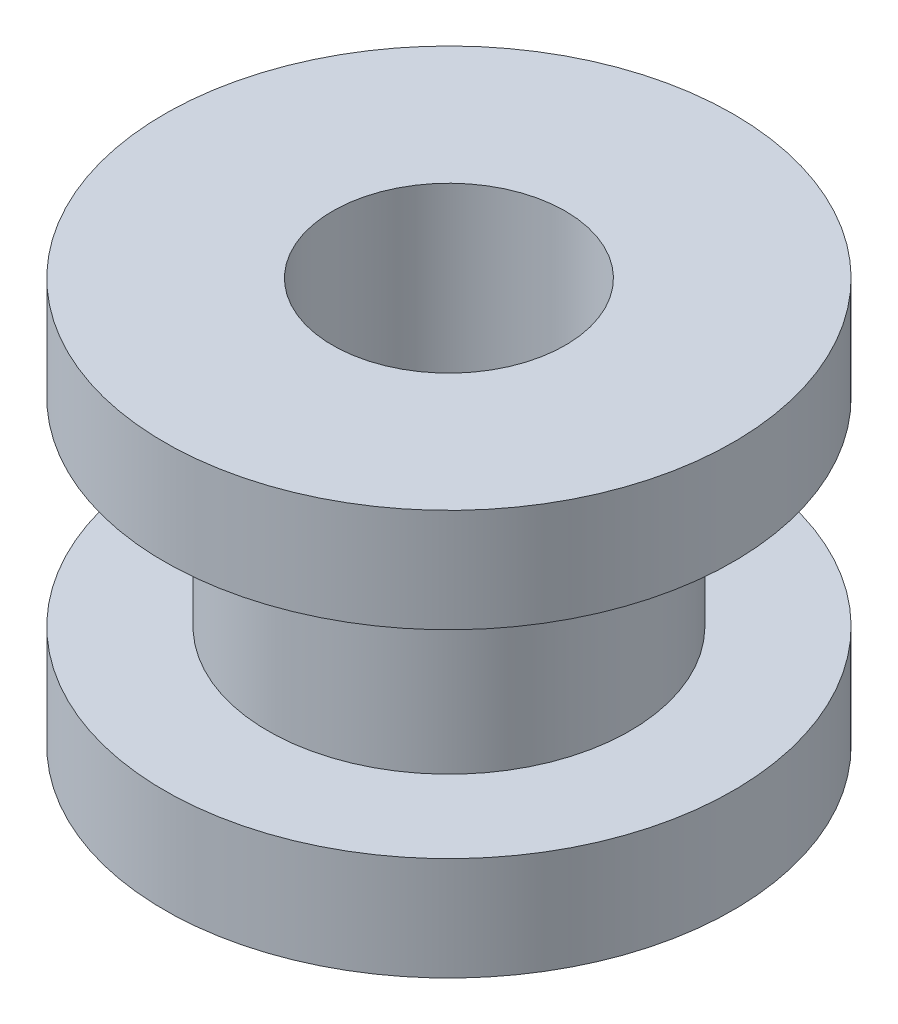
ISO-10303-21;
HEADER;
FILE_DESCRIPTION(('STEP AP214'),'2;1');
FILE_NAME('part.step','',(''),(''),'','','');
FILE_SCHEMA(('AUTOMOTIVE_DESIGN { 1 0 10303 214 1 1 1 1 }'));
ENDSEC;
DATA;
#1=APPLICATION_CONTEXT('core data for automotive mechanical design processes');
#2=APPLICATION_PROTOCOL_DEFINITION('international standard','automotive_design',2000,#1);
#3=PRODUCT_CONTEXT('',#1,'mechanical');
#4=PRODUCT('Part','Part','',(#3));
#5=PRODUCT_RELATED_PRODUCT_CATEGORY('part','',(#4));
#6=PRODUCT_DEFINITION_FORMATION('','',#4);
#7=PRODUCT_DEFINITION_CONTEXT('part definition',#1,'design');
#8=PRODUCT_DEFINITION('design','',#6,#7);
#9=PRODUCT_DEFINITION_SHAPE('','',#8);
#10=(LENGTH_UNIT() NAMED_UNIT(*) SI_UNIT(.MILLI.,.METRE.));
#11=(NAMED_UNIT(*) PLANE_ANGLE_UNIT() SI_UNIT($,.RADIAN.));
#12=(NAMED_UNIT(*) SI_UNIT($,.STERADIAN.) SOLID_ANGLE_UNIT());
#13=UNCERTAINTY_MEASURE_WITH_UNIT(LENGTH_MEASURE(1.E-05),#10,'distance_accuracy_value','');
#14=(GEOMETRIC_REPRESENTATION_CONTEXT(3) GLOBAL_UNCERTAINTY_ASSIGNED_CONTEXT((#13)) GLOBAL_UNIT_ASSIGNED_CONTEXT((#10,
#11,#12)) REPRESENTATION_CONTEXT('',''));
#15=CARTESIAN_POINT('',(0.,0.,0.));
#16=DIRECTION('',(0.,0.,1.));
#17=DIRECTION('',(1.,0.,0.));
#18=AXIS2_PLACEMENT_3D('',#15,#16,#17);
#19=CARTESIAN_POINT('',(0.,0.,0.));
#20=DIRECTION('',(0.,-1.,0.));
#21=DIRECTION('',(0.,0.,-1.));
#22=AXIS2_PLACEMENT_3D('',#19,#20,#21);
#23=CYLINDRICAL_SURFACE('',#22,3.3);
#24=CARTESIAN_POINT('',(0.,1.15,0.));
#25=DIRECTION('',(0.,-1.,0.));
#26=DIRECTION('',(0.,0.,-1.));
#27=AXIS2_PLACEMENT_3D('',#24,#25,#26);
#28=CIRCLE('',#27,3.3);
#29=CARTESIAN_POINT('',(0.,1.15,-3.3));
#30=VERTEX_POINT('',#29);
#31=EDGE_CURVE('E10',#30,#30,#28,.T.);
#32=ORIENTED_EDGE('',*,*,#31,.F.);
#33=EDGE_LOOP('',(#32));
#34=FACE_BOUND('',#33,.T.);
#35=CARTESIAN_POINT('',(0.,2.35,0.));
#36=DIRECTION('',(0.,-1.,0.));
#37=DIRECTION('',(0.,0.,-1.));
#38=AXIS2_PLACEMENT_3D('',#35,#36,#37);
#39=CIRCLE('',#38,3.3);
#40=CARTESIAN_POINT('',(0.,2.35,-3.3));
#41=VERTEX_POINT('',#40);
#42=EDGE_CURVE('E64',#41,#41,#39,.T.);
#43=ORIENTED_EDGE('',*,*,#42,.T.);
#44=EDGE_LOOP('',(#43));
#45=FACE_BOUND('',#44,.T.);
#46=ADVANCED_FACE('F36',(#34,#45),#23,.T.);
#47=CARTESIAN_POINT('',(-3.3,1.15,0.));
#48=DIRECTION('',(0.,1.,0.));
#49=DIRECTION('',(0.,0.,1.));
#50=AXIS2_PLACEMENT_3D('',#47,#48,#49);
#51=PLANE('',#50);
#52=CARTESIAN_POINT('',(0.,1.15,0.));
#53=DIRECTION('',(0.,-1.,0.));
#54=DIRECTION('',(0.,0.,-1.));
#55=AXIS2_PLACEMENT_3D('',#52,#53,#54);
#56=CIRCLE('',#55,2.1);
#57=CARTESIAN_POINT('',(0.,1.15,-2.1));
#58=VERTEX_POINT('',#57);
#59=EDGE_CURVE('E42',#58,#58,#56,.T.);
#60=ORIENTED_EDGE('',*,*,#59,.F.);
#61=EDGE_LOOP('',(#60));
#62=FACE_BOUND('',#61,.T.);
#63=ORIENTED_EDGE('',*,*,#31,.T.);
#64=EDGE_LOOP('',(#63));
#65=FACE_BOUND('',#64,.T.);
#66=ADVANCED_FACE('F101',(#62,#65),#51,.F.);
#67=CARTESIAN_POINT('',(0.,0.,0.));
#68=DIRECTION('',(0.,-1.,0.));
#69=DIRECTION('',(0.,0.,-1.));
#70=AXIS2_PLACEMENT_3D('',#67,#68,#69);
#71=CYLINDRICAL_SURFACE('',#70,2.1);
#72=CARTESIAN_POINT('',(0.,-1.15,0.));
#73=DIRECTION('',(0.,-1.,0.));
#74=DIRECTION('',(0.,0.,-1.));
#75=AXIS2_PLACEMENT_3D('',#72,#73,#74);
#76=CIRCLE('',#75,2.1);
#77=CARTESIAN_POINT('',(0.,-1.15,-2.1));
#78=VERTEX_POINT('',#77);
#79=EDGE_CURVE('E46',#78,#78,#76,.T.);
#80=ORIENTED_EDGE('',*,*,#79,.F.);
#81=EDGE_LOOP('',(#80));
#82=FACE_BOUND('',#81,.T.);
#83=ORIENTED_EDGE('',*,*,#59,.T.);
#84=EDGE_LOOP('',(#83));
#85=FACE_BOUND('',#84,.T.);
#86=ADVANCED_FACE('F96',(#82,#85),#71,.T.);
#87=CARTESIAN_POINT('',(-2.1,-1.15,0.));
#88=DIRECTION('',(0.,-1.,0.));
#89=DIRECTION('',(0.,0.,-1.));
#90=AXIS2_PLACEMENT_3D('',#87,#88,#89);
#91=PLANE('',#90);
#92=CARTESIAN_POINT('',(0.,-1.15,0.));
#93=DIRECTION('',(0.,-1.,0.));
#94=DIRECTION('',(0.,0.,-1.));
#95=AXIS2_PLACEMENT_3D('',#92,#93,#94);
#96=CIRCLE('',#95,3.3);
#97=CARTESIAN_POINT('',(0.,-1.15,-3.3));
#98=VERTEX_POINT('',#97);
#99=EDGE_CURVE('E50',#98,#98,#96,.T.);
#100=ORIENTED_EDGE('',*,*,#99,.F.);
#101=EDGE_LOOP('',(#100));
#102=FACE_BOUND('',#101,.T.);
#103=ORIENTED_EDGE('',*,*,#79,.T.);
#104=EDGE_LOOP('',(#103));
#105=FACE_BOUND('',#104,.T.);
#106=ADVANCED_FACE('F90',(#102,#105),#91,.F.);
#107=CARTESIAN_POINT('',(0.,0.,0.));
#108=DIRECTION('',(0.,-1.,0.));
#109=DIRECTION('',(0.,0.,-1.));
#110=AXIS2_PLACEMENT_3D('',#107,#108,#109);
#111=CYLINDRICAL_SURFACE('',#110,3.3);
#112=CARTESIAN_POINT('',(0.,-2.35,0.));
#113=DIRECTION('',(0.,-1.,0.));
#114=DIRECTION('',(0.,0.,-1.));
#115=AXIS2_PLACEMENT_3D('',#112,#113,#114);
#116=CIRCLE('',#115,3.3);
#117=CARTESIAN_POINT('',(0.,-2.35,-3.3));
#118=VERTEX_POINT('',#117);
#119=EDGE_CURVE('E55',#118,#118,#116,.T.);
#120=ORIENTED_EDGE('',*,*,#119,.F.);
#121=EDGE_LOOP('',(#120));
#122=FACE_BOUND('',#121,.T.);
#123=ORIENTED_EDGE('',*,*,#99,.T.);
#124=EDGE_LOOP('',(#123));
#125=FACE_BOUND('',#124,.T.);
#126=ADVANCED_FACE('F84',(#122,#125),#111,.T.);
#127=CARTESIAN_POINT('',(-3.3,-2.35,0.));
#128=DIRECTION('',(0.,1.,0.));
#129=DIRECTION('',(0.,0.,1.));
#130=AXIS2_PLACEMENT_3D('',#127,#128,#129);
#131=PLANE('',#130);
#132=CARTESIAN_POINT('',(0.,-2.35,0.));
#133=DIRECTION('',(0.,-1.,0.));
#134=DIRECTION('',(0.,0.,-1.));
#135=AXIS2_PLACEMENT_3D('',#132,#133,#134);
#136=CIRCLE('',#135,1.35);
#137=CARTESIAN_POINT('',(0.,-2.35,-1.35));
#138=VERTEX_POINT('',#137);
#139=EDGE_CURVE('E58',#138,#138,#136,.T.);
#140=ORIENTED_EDGE('',*,*,#139,.F.);
#141=EDGE_LOOP('',(#140));
#142=FACE_BOUND('',#141,.T.);
#143=ORIENTED_EDGE('',*,*,#119,.T.);
#144=EDGE_LOOP('',(#143));
#145=FACE_BOUND('',#144,.T.);
#146=ADVANCED_FACE('F78',(#142,#145),#131,.F.);
#147=CARTESIAN_POINT('',(0.,0.,0.));
#148=DIRECTION('',(0.,-1.,0.));
#149=DIRECTION('',(0.,0.,-1.));
#150=AXIS2_PLACEMENT_3D('',#147,#148,#149);
#151=CYLINDRICAL_SURFACE('',#150,1.35);
#152=CARTESIAN_POINT('',(0.,2.35,0.));
#153=DIRECTION('',(0.,-1.,0.));
#154=DIRECTION('',(0.,0.,-1.));
#155=AXIS2_PLACEMENT_3D('',#152,#153,#154);
#156=CIRCLE('',#155,1.35);
#157=CARTESIAN_POINT('',(0.,2.35,-1.35));
#158=VERTEX_POINT('',#157);
#159=EDGE_CURVE('E61',#158,#158,#156,.T.);
#160=ORIENTED_EDGE('',*,*,#159,.F.);
#161=EDGE_LOOP('',(#160));
#162=FACE_BOUND('',#161,.T.);
#163=ORIENTED_EDGE('',*,*,#139,.T.);
#164=EDGE_LOOP('',(#163));
#165=FACE_BOUND('',#164,.T.);
#166=ADVANCED_FACE('F72',(#162,#165),#151,.F.);
#167=CARTESIAN_POINT('',(-1.35,2.35,0.));
#168=DIRECTION('',(0.,-1.,0.));
#169=DIRECTION('',(0.,0.,-1.));
#170=AXIS2_PLACEMENT_3D('',#167,#168,#169);
#171=PLANE('',#170);
#172=ORIENTED_EDGE('',*,*,#42,.F.);
#173=EDGE_LOOP('',(#172));
#174=FACE_BOUND('',#173,.T.);
#175=ORIENTED_EDGE('',*,*,#159,.T.);
#176=EDGE_LOOP('',(#175));
#177=FACE_BOUND('',#176,.T.);
#178=ADVANCED_FACE('F69',(#174,#177),#171,.F.);
#179=CLOSED_SHELL('',(#46,#66,#86,#106,#126,#146,#166,#178));
#180=MANIFOLD_SOLID_BREP('B2',#179);
#181=ADVANCED_BREP_SHAPE_REPRESENTATION('',(#18,#180),#14);
#182=SHAPE_DEFINITION_REPRESENTATION(#9,#181);
ENDSEC;
END-ISO-10303-21;
